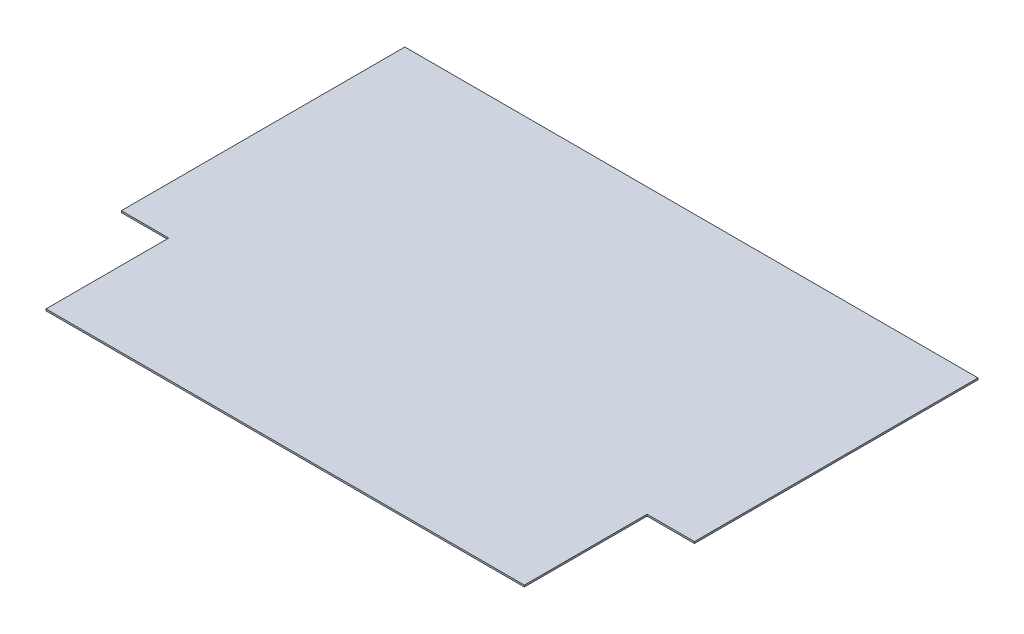
ISO-10303-21;
HEADER;
FILE_DESCRIPTION(('STEP AP214'),'2;1');
FILE_NAME('part.step','',(''),(''),'','','');
FILE_SCHEMA(('AUTOMOTIVE_DESIGN { 1 0 10303 214 1 1 1 1 }'));
ENDSEC;
DATA;
#1=APPLICATION_CONTEXT('core data for automotive mechanical design processes');
#2=APPLICATION_PROTOCOL_DEFINITION('international standard','automotive_design',2000,#1);
#3=PRODUCT_CONTEXT('',#1,'mechanical');
#4=PRODUCT('Part','Part','',(#3));
#5=PRODUCT_RELATED_PRODUCT_CATEGORY('part','',(#4));
#6=PRODUCT_DEFINITION_FORMATION('','',#4);
#7=PRODUCT_DEFINITION_CONTEXT('part definition',#1,'design');
#8=PRODUCT_DEFINITION('design','',#6,#7);
#9=PRODUCT_DEFINITION_SHAPE('','',#8);
#10=(LENGTH_UNIT() NAMED_UNIT(*) SI_UNIT(.MILLI.,.METRE.));
#11=(NAMED_UNIT(*) PLANE_ANGLE_UNIT() SI_UNIT($,.RADIAN.));
#12=(NAMED_UNIT(*) SI_UNIT($,.STERADIAN.) SOLID_ANGLE_UNIT());
#13=UNCERTAINTY_MEASURE_WITH_UNIT(LENGTH_MEASURE(1.E-05),#10,'distance_accuracy_value','');
#14=(GEOMETRIC_REPRESENTATION_CONTEXT(3) GLOBAL_UNCERTAINTY_ASSIGNED_CONTEXT((#13)) GLOBAL_UNIT_ASSIGNED_CONTEXT((#10,
#11,#12)) REPRESENTATION_CONTEXT('',''));
#15=CARTESIAN_POINT('',(0.,0.,0.));
#16=DIRECTION('',(0.,0.,1.));
#17=DIRECTION('',(1.,0.,0.));
#18=AXIS2_PLACEMENT_3D('',#15,#16,#17);
#19=CARTESIAN_POINT('',(-914.400000000001,6.35,0.));
#20=DIRECTION('',(0.,0.,-1.));
#21=DIRECTION('',(-1.,0.,0.));
#22=AXIS2_PLACEMENT_3D('',#19,#20,#21);
#23=PLANE('',#22);
#24=DIRECTION('',(1.,0.,0.));
#25=VECTOR('',#24,1.);
#26=CARTESIAN_POINT('',(-914.400000000001,0.,0.));
#27=LINE('',#26,#25);
#28=CARTESIAN_POINT('',(-1261.09951455284,0.,0.));
#29=VERTEX_POINT('',#28);
#30=CARTESIAN_POINT('',(533.400000000001,0.,0.));
#31=VERTEX_POINT('',#30);
#32=EDGE_CURVE('E114',#29,#31,#27,.T.);
#33=ORIENTED_EDGE('',*,*,#32,.T.);
#34=DIRECTION('',(0.,1.,0.));
#35=VECTOR('',#34,1.);
#36=CARTESIAN_POINT('',(533.400000000001,0.,0.));
#37=LINE('',#36,#35);
#38=CARTESIAN_POINT('',(533.400000000001,6.35,0.));
#39=VERTEX_POINT('',#38);
#40=EDGE_CURVE('E118',#31,#39,#37,.T.);
#41=ORIENTED_EDGE('',*,*,#40,.T.);
#42=DIRECTION('',(1.,0.,0.));
#43=VECTOR('',#42,1.);
#44=CARTESIAN_POINT('',(-914.400000000001,6.35,0.));
#45=LINE('',#44,#43);
#46=CARTESIAN_POINT('',(-1261.09951455284,6.35,0.));
#47=VERTEX_POINT('',#46);
#48=EDGE_CURVE('E43',#47,#39,#45,.T.);
#49=ORIENTED_EDGE('',*,*,#48,.F.);
#50=DIRECTION('',(0.,1.,0.));
#51=VECTOR('',#50,1.);
#52=CARTESIAN_POINT('',(-1261.09951455284,0.,0.));
#53=LINE('',#52,#51);
#54=EDGE_CURVE('E130',#29,#47,#53,.T.);
#55=ORIENTED_EDGE('',*,*,#54,.F.);
#56=EDGE_LOOP('',(#33,#41,#49,#55));
#57=FACE_BOUND('',#56,.T.);
#58=ADVANCED_FACE('F35',(#57),#23,.F.);
#59=CARTESIAN_POINT('',(-1438.89951455284,6.35,0.));
#60=DIRECTION('',(1.,0.,0.));
#61=DIRECTION('',(0.,0.,-1.));
#62=AXIS2_PLACEMENT_3D('',#59,#60,#61);
#63=PLANE('',#62);
#64=DIRECTION('',(0.,0.,1.));
#65=VECTOR('',#64,1.);
#66=CARTESIAN_POINT('',(-1438.89951455284,6.35,0.));
#67=LINE('',#66,#65);
#68=CARTESIAN_POINT('',(-1438.89951455284,6.35,-1524.));
#69=VERTEX_POINT('',#68);
#70=CARTESIAN_POINT('',(-1438.89951455284,6.35,-460.375));
#71=VERTEX_POINT('',#70);
#72=EDGE_CURVE('E11',#69,#71,#67,.T.);
#73=ORIENTED_EDGE('',*,*,#72,.F.);
#74=DIRECTION('',(0.,1.,0.));
#75=VECTOR('',#74,1.);
#76=CARTESIAN_POINT('',(-1438.89951455284,0.,-1524.));
#77=LINE('',#76,#75);
#78=CARTESIAN_POINT('',(-1438.89951455284,0.,-1524.));
#79=VERTEX_POINT('',#78);
#80=EDGE_CURVE('E101',#79,#69,#77,.T.);
#81=ORIENTED_EDGE('',*,*,#80,.F.);
#82=DIRECTION('',(0.,0.,1.));
#83=VECTOR('',#82,1.);
#84=CARTESIAN_POINT('',(-1438.89951455284,0.,0.));
#85=LINE('',#84,#83);
#86=CARTESIAN_POINT('',(-1438.89951455284,0.,-460.375));
#87=VERTEX_POINT('',#86);
#88=EDGE_CURVE('E38',#79,#87,#85,.T.);
#89=ORIENTED_EDGE('',*,*,#88,.T.);
#90=DIRECTION('',(0.,1.,0.));
#91=VECTOR('',#90,1.);
#92=CARTESIAN_POINT('',(-1438.89951455284,0.,-460.375));
#93=LINE('',#92,#91);
#94=EDGE_CURVE('E128',#87,#71,#93,.T.);
#95=ORIENTED_EDGE('',*,*,#94,.T.);
#96=EDGE_LOOP('',(#73,#81,#89,#95));
#97=FACE_BOUND('',#96,.T.);
#98=ADVANCED_FACE('F107',(#97),#63,.F.);
#99=CARTESIAN_POINT('',(0.,6.35,0.));
#100=DIRECTION('',(0.,-1.,0.));
#101=DIRECTION('',(0.,0.,-1.));
#102=AXIS2_PLACEMENT_3D('',#99,#100,#101);
#103=PLANE('',#102);
#104=DIRECTION('',(0.,0.,1.));
#105=VECTOR('',#104,1.);
#106=CARTESIAN_POINT('',(711.200000000001,6.35,-460.375));
#107=LINE('',#106,#105);
#108=CARTESIAN_POINT('',(711.200000000001,6.35,-1524.));
#109=VERTEX_POINT('',#108);
#110=CARTESIAN_POINT('',(711.200000000001,6.35,-460.375));
#111=VERTEX_POINT('',#110);
#112=EDGE_CURVE('E132',#109,#111,#107,.T.);
#113=ORIENTED_EDGE('',*,*,#112,.F.);
#114=DIRECTION('',(1.,0.,0.));
#115=VECTOR('',#114,1.);
#116=CARTESIAN_POINT('',(-1438.89951455284,6.35,-1524.));
#117=LINE('',#116,#115);
#118=EDGE_CURVE('E51',#69,#109,#117,.T.);
#119=ORIENTED_EDGE('',*,*,#118,.F.);
#120=ORIENTED_EDGE('',*,*,#72,.T.);
#121=DIRECTION('',(-1.,0.,0.));
#122=VECTOR('',#121,1.);
#123=CARTESIAN_POINT('',(-1261.09951455284,6.35,-460.375));
#124=LINE('',#123,#122);
#125=CARTESIAN_POINT('',(-1261.09951455284,6.35,-460.375));
#126=VERTEX_POINT('',#125);
#127=EDGE_CURVE('E133',#126,#71,#124,.T.);
#128=ORIENTED_EDGE('',*,*,#127,.F.);
#129=DIRECTION('',(0.,0.,-1.));
#130=VECTOR('',#129,1.);
#131=CARTESIAN_POINT('',(-1261.09951455284,6.35,-460.375));
#132=LINE('',#131,#130);
#133=EDGE_CURVE('E137',#47,#126,#132,.T.);
#134=ORIENTED_EDGE('',*,*,#133,.F.);
#135=ORIENTED_EDGE('',*,*,#48,.T.);
#136=DIRECTION('',(0.,0.,1.));
#137=VECTOR('',#136,1.);
#138=CARTESIAN_POINT('',(533.400000000001,6.35,0.));
#139=LINE('',#138,#137);
#140=CARTESIAN_POINT('',(533.400000000001,6.35,-460.375));
#141=VERTEX_POINT('',#140);
#142=EDGE_CURVE('E147',#141,#39,#139,.T.);
#143=ORIENTED_EDGE('',*,*,#142,.F.);
#144=DIRECTION('',(-1.,0.,0.));
#145=VECTOR('',#144,1.);
#146=CARTESIAN_POINT('',(711.200000000001,6.35,-460.375));
#147=LINE('',#146,#145);
#148=EDGE_CURVE('E150',#111,#141,#147,.T.);
#149=ORIENTED_EDGE('',*,*,#148,.F.);
#150=EDGE_LOOP('',(#113,#119,#120,#128,#134,#135,#143,#149));
#151=FACE_BOUND('',#150,.T.);
#152=ADVANCED_FACE('F167',(#151),#103,.F.);
#153=CARTESIAN_POINT('',(0.,0.,0.));
#154=DIRECTION('',(0.,-1.,0.));
#155=DIRECTION('',(0.,0.,-1.));
#156=AXIS2_PLACEMENT_3D('',#153,#154,#155);
#157=PLANE('',#156);
#158=DIRECTION('',(1.,0.,0.));
#159=VECTOR('',#158,1.);
#160=CARTESIAN_POINT('',(-1438.89951455284,0.,-1524.));
#161=LINE('',#160,#159);
#162=CARTESIAN_POINT('',(711.2,0.,-1524.));
#163=VERTEX_POINT('',#162);
#164=EDGE_CURVE('E99',#79,#163,#161,.T.);
#165=ORIENTED_EDGE('',*,*,#164,.T.);
#166=DIRECTION('',(0.,0.,1.));
#167=VECTOR('',#166,1.);
#168=CARTESIAN_POINT('',(711.200000000001,0.,-460.375));
#169=LINE('',#168,#167);
#170=CARTESIAN_POINT('',(711.200000000001,0.,-460.375));
#171=VERTEX_POINT('',#170);
#172=EDGE_CURVE('E149',#163,#171,#169,.T.);
#173=ORIENTED_EDGE('',*,*,#172,.T.);
#174=DIRECTION('',(-1.,0.,0.));
#175=VECTOR('',#174,1.);
#176=CARTESIAN_POINT('',(711.200000000001,0.,-460.375));
#177=LINE('',#176,#175);
#178=CARTESIAN_POINT('',(533.400000000001,0.,-460.375));
#179=VERTEX_POINT('',#178);
#180=EDGE_CURVE('E156',#171,#179,#177,.T.);
#181=ORIENTED_EDGE('',*,*,#180,.T.);
#182=DIRECTION('',(0.,0.,1.));
#183=VECTOR('',#182,1.);
#184=CARTESIAN_POINT('',(533.400000000001,0.,0.));
#185=LINE('',#184,#183);
#186=EDGE_CURVE('E145',#179,#31,#185,.T.);
#187=ORIENTED_EDGE('',*,*,#186,.T.);
#188=ORIENTED_EDGE('',*,*,#32,.F.);
#189=DIRECTION('',(0.,0.,-1.));
#190=VECTOR('',#189,1.);
#191=CARTESIAN_POINT('',(-1261.09951455284,0.,-460.375));
#192=LINE('',#191,#190);
#193=CARTESIAN_POINT('',(-1261.09951455284,0.,-460.375));
#194=VERTEX_POINT('',#193);
#195=EDGE_CURVE('E136',#29,#194,#192,.T.);
#196=ORIENTED_EDGE('',*,*,#195,.T.);
#197=DIRECTION('',(-1.,0.,0.));
#198=VECTOR('',#197,1.);
#199=CARTESIAN_POINT('',(-1261.09951455284,0.,-460.375));
#200=LINE('',#199,#198);
#201=EDGE_CURVE('E113',#194,#87,#200,.T.);
#202=ORIENTED_EDGE('',*,*,#201,.T.);
#203=ORIENTED_EDGE('',*,*,#88,.F.);
#204=EDGE_LOOP('',(#165,#173,#181,#187,#188,#196,#202,#203));
#205=FACE_BOUND('',#204,.T.);
#206=ADVANCED_FACE('F110',(#205),#157,.T.);
#207=CARTESIAN_POINT('',(-1261.09951455284,0.,-460.375));
#208=DIRECTION('',(1.,0.,0.));
#209=DIRECTION('',(0.,0.,-1.));
#210=AXIS2_PLACEMENT_3D('',#207,#208,#209);
#211=PLANE('',#210);
#212=ORIENTED_EDGE('',*,*,#133,.T.);
#213=DIRECTION('',(0.,1.,0.));
#214=VECTOR('',#213,1.);
#215=CARTESIAN_POINT('',(-1261.09951455284,0.,-460.375));
#216=LINE('',#215,#214);
#217=EDGE_CURVE('E126',#194,#126,#216,.T.);
#218=ORIENTED_EDGE('',*,*,#217,.F.);
#219=ORIENTED_EDGE('',*,*,#195,.F.);
#220=ORIENTED_EDGE('',*,*,#54,.T.);
#221=EDGE_LOOP('',(#212,#218,#219,#220));
#222=FACE_BOUND('',#221,.T.);
#223=ADVANCED_FACE('F179',(#222),#211,.F.);
#224=CARTESIAN_POINT('',(-1261.09951455284,0.,-460.375));
#225=DIRECTION('',(0.,0.,-1.));
#226=DIRECTION('',(-1.,0.,0.));
#227=AXIS2_PLACEMENT_3D('',#224,#225,#226);
#228=PLANE('',#227);
#229=ORIENTED_EDGE('',*,*,#127,.T.);
#230=ORIENTED_EDGE('',*,*,#94,.F.);
#231=ORIENTED_EDGE('',*,*,#201,.F.);
#232=ORIENTED_EDGE('',*,*,#217,.T.);
#233=EDGE_LOOP('',(#229,#230,#231,#232));
#234=FACE_BOUND('',#233,.T.);
#235=ADVANCED_FACE('F181',(#234),#228,.F.);
#236=CARTESIAN_POINT('',(533.400000000001,0.,0.));
#237=DIRECTION('',(-1.,0.,0.));
#238=DIRECTION('',(0.,0.,1.));
#239=AXIS2_PLACEMENT_3D('',#236,#237,#238);
#240=PLANE('',#239);
#241=ORIENTED_EDGE('',*,*,#142,.T.);
#242=ORIENTED_EDGE('',*,*,#40,.F.);
#243=ORIENTED_EDGE('',*,*,#186,.F.);
#244=DIRECTION('',(0.,1.,0.));
#245=VECTOR('',#244,1.);
#246=CARTESIAN_POINT('',(533.400000000001,0.,-460.375));
#247=LINE('',#246,#245);
#248=EDGE_CURVE('E123',#179,#141,#247,.T.);
#249=ORIENTED_EDGE('',*,*,#248,.T.);
#250=EDGE_LOOP('',(#241,#242,#243,#249));
#251=FACE_BOUND('',#250,.T.);
#252=ADVANCED_FACE('F174',(#251),#240,.F.);
#253=CARTESIAN_POINT('',(711.200000000001,0.,-460.375));
#254=DIRECTION('',(0.,0.,-1.));
#255=DIRECTION('',(-1.,0.,0.));
#256=AXIS2_PLACEMENT_3D('',#253,#254,#255);
#257=PLANE('',#256);
#258=ORIENTED_EDGE('',*,*,#148,.T.);
#259=ORIENTED_EDGE('',*,*,#248,.F.);
#260=ORIENTED_EDGE('',*,*,#180,.F.);
#261=DIRECTION('',(0.,1.,0.));
#262=VECTOR('',#261,1.);
#263=CARTESIAN_POINT('',(711.200000000001,0.,-460.375));
#264=LINE('',#263,#262);
#265=EDGE_CURVE('E142',#171,#111,#264,.T.);
#266=ORIENTED_EDGE('',*,*,#265,.T.);
#267=EDGE_LOOP('',(#258,#259,#260,#266));
#268=FACE_BOUND('',#267,.T.);
#269=ADVANCED_FACE('F170',(#268),#257,.F.);
#270=CARTESIAN_POINT('',(711.200000000001,0.,-460.375));
#271=DIRECTION('',(-1.,0.,0.));
#272=DIRECTION('',(0.,0.,1.));
#273=AXIS2_PLACEMENT_3D('',#270,#271,#272);
#274=PLANE('',#273);
#275=ORIENTED_EDGE('',*,*,#172,.F.);
#276=DIRECTION('',(0.,1.,0.));
#277=VECTOR('',#276,1.);
#278=CARTESIAN_POINT('',(711.2,0.,-1524.));
#279=LINE('',#278,#277);
#280=EDGE_CURVE('E102',#163,#109,#279,.T.);
#281=ORIENTED_EDGE('',*,*,#280,.T.);
#282=ORIENTED_EDGE('',*,*,#112,.T.);
#283=ORIENTED_EDGE('',*,*,#265,.F.);
#284=EDGE_LOOP('',(#275,#281,#282,#283));
#285=FACE_BOUND('',#284,.T.);
#286=ADVANCED_FACE('F163',(#285),#274,.F.);
#287=CARTESIAN_POINT('',(-1438.89951455284,0.,-1524.));
#288=DIRECTION('',(0.,0.,1.));
#289=DIRECTION('',(1.,0.,0.));
#290=AXIS2_PLACEMENT_3D('',#287,#288,#289);
#291=PLANE('',#290);
#292=ORIENTED_EDGE('',*,*,#118,.T.);
#293=ORIENTED_EDGE('',*,*,#280,.F.);
#294=ORIENTED_EDGE('',*,*,#164,.F.);
#295=ORIENTED_EDGE('',*,*,#80,.T.);
#296=EDGE_LOOP('',(#292,#293,#294,#295));
#297=FACE_BOUND('',#296,.T.);
#298=ADVANCED_FACE('F100',(#297),#291,.F.);
#299=CLOSED_SHELL('',(#58,#98,#152,#206,#223,#235,#252,#269,#286,#298));
#300=MANIFOLD_SOLID_BREP('B2',#299);
#301=ADVANCED_BREP_SHAPE_REPRESENTATION('',(#18,#300),#14);
#302=SHAPE_DEFINITION_REPRESENTATION(#9,#301);
ENDSEC;
END-ISO-10303-21;
